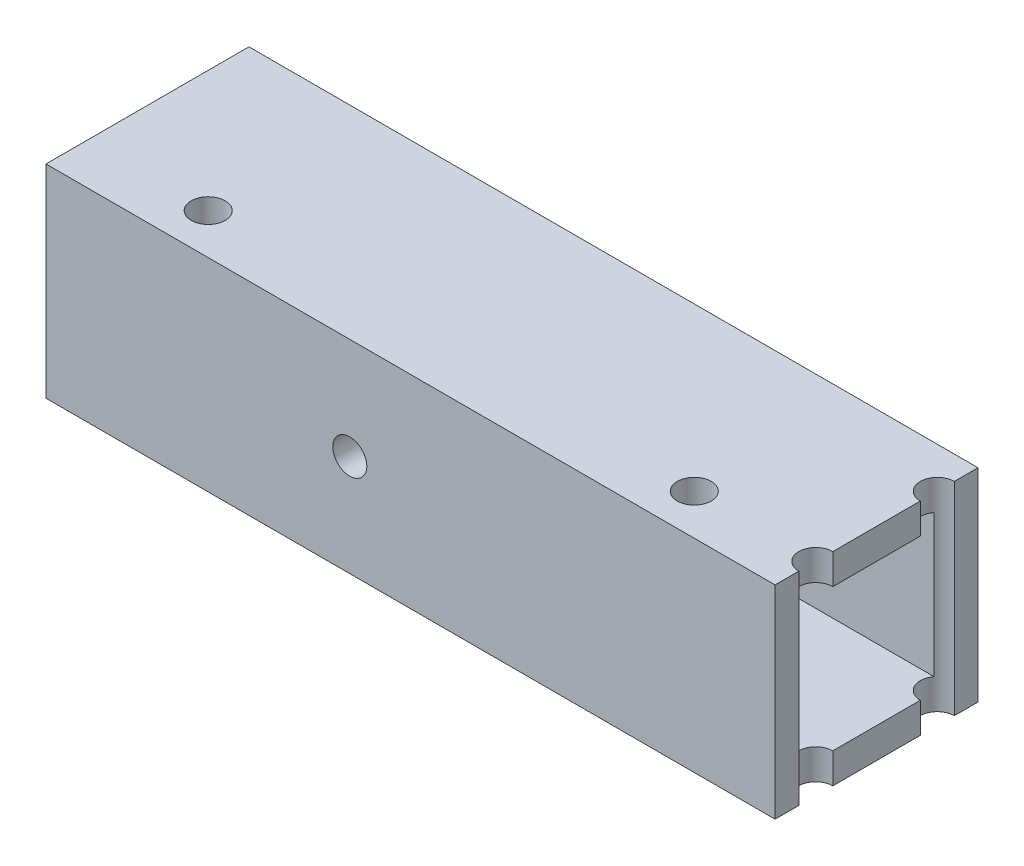
ISO-10303-21;
HEADER;
FILE_DESCRIPTION(('STEP AP214'),'2;1');
FILE_NAME('part.step','',(''),(''),'','','');
FILE_SCHEMA(('AUTOMOTIVE_DESIGN { 1 0 10303 214 1 1 1 1 }'));
ENDSEC;
DATA;
#1=APPLICATION_CONTEXT('core data for automotive mechanical design processes');
#2=APPLICATION_PROTOCOL_DEFINITION('international standard','automotive_design',2000,#1);
#3=PRODUCT_CONTEXT('',#1,'mechanical');
#4=PRODUCT('Part','Part','',(#3));
#5=PRODUCT_RELATED_PRODUCT_CATEGORY('part','',(#4));
#6=PRODUCT_DEFINITION_FORMATION('','',#4);
#7=PRODUCT_DEFINITION_CONTEXT('part definition',#1,'design');
#8=PRODUCT_DEFINITION('design','',#6,#7);
#9=PRODUCT_DEFINITION_SHAPE('','',#8);
#10=(LENGTH_UNIT() NAMED_UNIT(*) SI_UNIT(.MILLI.,.METRE.));
#11=(NAMED_UNIT(*) PLANE_ANGLE_UNIT() SI_UNIT($,.RADIAN.));
#12=(NAMED_UNIT(*) SI_UNIT($,.STERADIAN.) SOLID_ANGLE_UNIT());
#13=UNCERTAINTY_MEASURE_WITH_UNIT(LENGTH_MEASURE(1.E-05),#10,'distance_accuracy_value','');
#14=(GEOMETRIC_REPRESENTATION_CONTEXT(3) GLOBAL_UNCERTAINTY_ASSIGNED_CONTEXT((#13)) GLOBAL_UNIT_ASSIGNED_CONTEXT((#10,
#11,#12)) REPRESENTATION_CONTEXT('',''));
#15=CARTESIAN_POINT('',(0.,0.,0.));
#16=DIRECTION('',(0.,0.,1.));
#17=DIRECTION('',(1.,0.,0.));
#18=AXIS2_PLACEMENT_3D('',#15,#16,#17);
#19=CARTESIAN_POINT('',(-32.2248595461292,-133.7,131.699999999999));
#20=DIRECTION('',(0.,0.,1.));
#21=DIRECTION('',(1.,0.,0.));
#22=AXIS2_PLACEMENT_3D('',#19,#20,#21);
#23=PLANE('',#22);
#24=DIRECTION('',(1.,0.,0.));
#25=VECTOR('',#24,1.);
#26=CARTESIAN_POINT('',(-32.2248595461292,-133.7,131.699999999999));
#27=LINE('',#26,#25);
#28=CARTESIAN_POINT('',(-47.7751404538709,-133.7,131.699999999999));
#29=VERTEX_POINT('',#28);
#30=CARTESIAN_POINT('',(-32.2248595461292,-133.7,131.699999999999));
#31=VERTEX_POINT('',#30);
#32=EDGE_CURVE('E193',#29,#31,#27,.T.);
#33=ORIENTED_EDGE('',*,*,#32,.F.);
#34=DIRECTION('',(0.,1.,0.));
#35=VECTOR('',#34,1.);
#36=CARTESIAN_POINT('',(-47.7751404538709,-105.3,131.699999999999));
#37=LINE('',#36,#35);
#38=CARTESIAN_POINT('',(-47.7751404538709,-110.3,131.699999999999));
#39=VERTEX_POINT('',#38);
#40=EDGE_CURVE('E61',#29,#39,#37,.T.);
#41=ORIENTED_EDGE('',*,*,#40,.T.);
#42=DIRECTION('',(1.,0.,0.));
#43=VECTOR('',#42,1.);
#44=CARTESIAN_POINT('',(-32.2248595461292,-110.3,131.699999999999));
#45=LINE('',#44,#43);
#46=CARTESIAN_POINT('',(-32.2248595461291,-110.3,131.699999999999));
#47=VERTEX_POINT('',#46);
#48=EDGE_CURVE('E205',#39,#47,#45,.T.);
#49=ORIENTED_EDGE('',*,*,#48,.T.);
#50=DIRECTION('',(0.,1.,0.));
#51=VECTOR('',#50,1.);
#52=CARTESIAN_POINT('',(-32.2248595461292,-133.7,131.699999999999));
#53=LINE('',#52,#51);
#54=EDGE_CURVE('E197',#31,#47,#53,.T.);
#55=ORIENTED_EDGE('',*,*,#54,.F.);
#56=EDGE_LOOP('',(#33,#41,#49,#55));
#57=FACE_BOUND('',#56,.T.);
#58=ADVANCED_FACE('F43',(#57),#23,.F.);
#59=CARTESIAN_POINT('',(-100.,-122.,131.7));
#60=DIRECTION('',(0.,0.,-1.));
#61=DIRECTION('',(-1.,0.,0.));
#62=AXIS2_PLACEMENT_3D('',#59,#60,#61);
#63=CIRCLE('',#62,2.79999999999998);
#64=CARTESIAN_POINT('',(-102.8,-122.,131.7));
#65=VERTEX_POINT('',#64);
#66=EDGE_CURVE('E421',#65,#65,#63,.T.);
#67=ORIENTED_EDGE('',*,*,#66,.F.);
#68=EDGE_LOOP('',(#67));
#69=FACE_BOUND('',#68,.T.);
#70=CARTESIAN_POINT('',(-127.775140453871,-110.3,131.7));
#71=VERTEX_POINT('',#70);
#72=CARTESIAN_POINT('',(-52.2248595461291,-110.3,131.699999999999));
#73=VERTEX_POINT('',#72);
#74=EDGE_CURVE('E185',#71,#73,#45,.T.);
#75=ORIENTED_EDGE('',*,*,#74,.T.);
#76=DIRECTION('',(0.,1.,0.));
#77=VECTOR('',#76,1.);
#78=CARTESIAN_POINT('',(-52.2248595461291,-105.3,131.699999999999));
#79=LINE('',#78,#77);
#80=CARTESIAN_POINT('',(-52.2248595461291,-133.7,131.699999999999));
#81=VERTEX_POINT('',#80);
#82=EDGE_CURVE('E171',#73,#81,#79,.F.);
#83=ORIENTED_EDGE('',*,*,#82,.T.);
#84=CARTESIAN_POINT('',(-127.775140453871,-133.7,131.7));
#85=VERTEX_POINT('',#84);
#86=EDGE_CURVE('E183',#85,#81,#27,.T.);
#87=ORIENTED_EDGE('',*,*,#86,.F.);
#88=DIRECTION('',(0.,1.,0.));
#89=VECTOR('',#88,1.);
#90=CARTESIAN_POINT('',(-127.775140453871,-105.3,131.7));
#91=LINE('',#90,#89);
#92=EDGE_CURVE('E69',#85,#71,#91,.T.);
#93=ORIENTED_EDGE('',*,*,#92,.T.);
#94=EDGE_LOOP('',(#75,#83,#87,#93));
#95=FACE_BOUND('',#94,.T.);
#96=ADVANCED_FACE('F182',(#69,#95),#23,.F.);
#97=CARTESIAN_POINT('',(-30.,-110.3,110.));
#98=DIRECTION('',(0.,-1.,0.));
#99=DIRECTION('',(0.,0.,-1.));
#100=AXIS2_PLACEMENT_3D('',#97,#98,#99);
#101=PLANE('',#100);
#102=CARTESIAN_POINT('',(-50.,-110.3,130.));
#103=DIRECTION('',(0.,-1.,0.));
#104=DIRECTION('',(0.,0.,-1.));
#105=AXIS2_PLACEMENT_3D('',#102,#103,#104);
#106=CIRCLE('',#105,2.79999999999998);
#107=EDGE_CURVE('E405',#73,#39,#106,.T.);
#108=ORIENTED_EDGE('',*,*,#107,.F.);
#109=ORIENTED_EDGE('',*,*,#74,.F.);
#110=CARTESIAN_POINT('',(-130.,-110.3,130.));
#111=DIRECTION('',(0.,-1.,0.));
#112=DIRECTION('',(0.,0.,-1.));
#113=AXIS2_PLACEMENT_3D('',#110,#111,#112);
#114=CIRCLE('',#113,2.79999999999998);
#115=CARTESIAN_POINT('',(-132.224859546129,-110.3,131.7));
#116=VERTEX_POINT('',#115);
#117=EDGE_CURVE('E388',#116,#71,#114,.T.);
#118=ORIENTED_EDGE('',*,*,#117,.F.);
#119=CARTESIAN_POINT('',(-150.,-110.3,131.7));
#120=VERTEX_POINT('',#119);
#121=EDGE_CURVE('E207',#120,#116,#45,.T.);
#122=ORIENTED_EDGE('',*,*,#121,.F.);
#123=DIRECTION('',(0.,0.,-1.));
#124=VECTOR('',#123,1.);
#125=CARTESIAN_POINT('',(-150.,-110.3,132.8));
#126=LINE('',#125,#124);
#127=CARTESIAN_POINT('',(-150.,-110.3,108.3));
#128=VERTEX_POINT('',#127);
#129=EDGE_CURVE('E247',#120,#128,#126,.T.);
#130=ORIENTED_EDGE('',*,*,#129,.T.);
#131=DIRECTION('',(-1.,0.,0.));
#132=VECTOR('',#131,1.);
#133=CARTESIAN_POINT('',(-150.,-110.3,108.3));
#134=LINE('',#133,#132);
#135=CARTESIAN_POINT('',(-32.2248595461215,-110.3,108.299999999999));
#136=VERTEX_POINT('',#135);
#137=EDGE_CURVE('E319',#136,#128,#134,.T.);
#138=ORIENTED_EDGE('',*,*,#137,.F.);
#139=CARTESIAN_POINT('',(-29.9999999999975,-110.3,110.000000000002));
#140=DIRECTION('',(0.,-1.,0.));
#141=DIRECTION('',(0.,0.,1.));
#142=AXIS2_PLACEMENT_3D('',#139,#140,#141);
#143=CIRCLE('',#142,2.79999999999783);
#144=CARTESIAN_POINT('',(-30.,-110.3,112.799999999995));
#145=VERTEX_POINT('',#144);
#146=EDGE_CURVE('E313',#145,#136,#143,.T.);
#147=ORIENTED_EDGE('',*,*,#146,.F.);
#148=DIRECTION('',(0.,0.,1.));
#149=VECTOR('',#148,1.);
#150=CARTESIAN_POINT('',(-30.,-110.3,112.8));
#151=LINE('',#150,#149);
#152=CARTESIAN_POINT('',(-30.,-110.3,127.2));
#153=VERTEX_POINT('',#152);
#154=EDGE_CURVE('E252',#145,#153,#151,.T.);
#155=ORIENTED_EDGE('',*,*,#154,.T.);
#156=CARTESIAN_POINT('',(-30.,-110.3,130.));
#157=DIRECTION('',(0.,-1.,0.));
#158=DIRECTION('',(0.,0.,1.));
#159=AXIS2_PLACEMENT_3D('',#156,#157,#158);
#160=CIRCLE('',#159,2.8);
#161=EDGE_CURVE('E202',#47,#153,#160,.T.);
#162=ORIENTED_EDGE('',*,*,#161,.F.);
#163=ORIENTED_EDGE('',*,*,#48,.F.);
#164=EDGE_LOOP('',(#108,#109,#118,#122,#130,#138,#147,#155,#162,#163));
#165=FACE_BOUND('',#164,.T.);
#166=ADVANCED_FACE('F337',(#165),#101,.T.);
#167=CARTESIAN_POINT('',(-30.,-105.3,112.8));
#168=DIRECTION('',(1.,0.,0.));
#169=DIRECTION('',(0.,0.,-1.));
#170=AXIS2_PLACEMENT_3D('',#167,#168,#169);
#171=PLANE('',#170);
#172=ORIENTED_EDGE('',*,*,#154,.F.);
#173=DIRECTION('',(0.,-1.,0.));
#174=VECTOR('',#173,1.);
#175=CARTESIAN_POINT('',(-30.,-105.3,112.8));
#176=LINE('',#175,#174);
#177=CARTESIAN_POINT('',(-30.,-105.3,112.799999999995));
#178=VERTEX_POINT('',#177);
#179=EDGE_CURVE('E264',#178,#145,#176,.T.);
#180=ORIENTED_EDGE('',*,*,#179,.F.);
#181=DIRECTION('',(0.,0.,1.));
#182=VECTOR('',#181,1.);
#183=CARTESIAN_POINT('',(-30.,-105.3,112.8));
#184=LINE('',#183,#182);
#185=CARTESIAN_POINT('',(-30.,-105.3,127.2));
#186=VERTEX_POINT('',#185);
#187=EDGE_CURVE('E251',#178,#186,#184,.T.);
#188=ORIENTED_EDGE('',*,*,#187,.T.);
#189=DIRECTION('',(0.,-1.,0.));
#190=VECTOR('',#189,1.);
#191=CARTESIAN_POINT('',(-30.,-105.3,127.2));
#192=LINE('',#191,#190);
#193=EDGE_CURVE('E53',#186,#153,#192,.T.);
#194=ORIENTED_EDGE('',*,*,#193,.T.);
#195=EDGE_LOOP('',(#172,#180,#188,#194));
#196=FACE_BOUND('',#195,.T.);
#197=ADVANCED_FACE('F472',(#196),#171,.T.);
#198=CARTESIAN_POINT('',(-150.,-105.3,132.8));
#199=DIRECTION('',(-1.,0.,0.));
#200=DIRECTION('',(0.,0.,1.));
#201=AXIS2_PLACEMENT_3D('',#198,#199,#200);
#202=PLANE('',#201);
#203=DIRECTION('',(0.,1.,0.));
#204=VECTOR('',#203,1.);
#205=CARTESIAN_POINT('',(-150.,-133.7,131.7));
#206=LINE('',#205,#204);
#207=CARTESIAN_POINT('',(-150.,-133.7,131.7));
#208=VERTEX_POINT('',#207);
#209=EDGE_CURVE('E214',#208,#120,#206,.T.);
#210=ORIENTED_EDGE('',*,*,#209,.F.);
#211=DIRECTION('',(0.,0.,-1.));
#212=VECTOR('',#211,1.);
#213=CARTESIAN_POINT('',(-150.,-133.7,103.3));
#214=LINE('',#213,#212);
#215=CARTESIAN_POINT('',(-150.,-133.7,108.3));
#216=VERTEX_POINT('',#215);
#217=EDGE_CURVE('E304',#208,#216,#214,.T.);
#218=ORIENTED_EDGE('',*,*,#217,.T.);
#219=DIRECTION('',(0.,1.,0.));
#220=VECTOR('',#219,1.);
#221=CARTESIAN_POINT('',(-150.,-133.7,108.3));
#222=LINE('',#221,#220);
#223=EDGE_CURVE('E323',#216,#128,#222,.T.);
#224=ORIENTED_EDGE('',*,*,#223,.T.);
#225=ORIENTED_EDGE('',*,*,#129,.F.);
#226=EDGE_LOOP('',(#210,#218,#224,#225));
#227=FACE_BOUND('',#226,.T.);
#228=DIRECTION('',(0.,0.,-1.));
#229=VECTOR('',#228,1.);
#230=CARTESIAN_POINT('',(-150.,-138.7,103.3));
#231=LINE('',#230,#229);
#232=CARTESIAN_POINT('',(-150.,-138.7,136.7));
#233=VERTEX_POINT('',#232);
#234=CARTESIAN_POINT('',(-150.,-138.7,103.3));
#235=VERTEX_POINT('',#234);
#236=EDGE_CURVE('E296',#233,#235,#231,.T.);
#237=ORIENTED_EDGE('',*,*,#236,.F.);
#238=DIRECTION('',(0.,-1.,0.));
#239=VECTOR('',#238,1.);
#240=CARTESIAN_POINT('',(-150.,-110.3,136.7));
#241=LINE('',#240,#239);
#242=CARTESIAN_POINT('',(-150.,-105.3,136.7));
#243=VERTEX_POINT('',#242);
#244=EDGE_CURVE('E226',#243,#233,#241,.T.);
#245=ORIENTED_EDGE('',*,*,#244,.F.);
#246=DIRECTION('',(0.,0.,-1.));
#247=VECTOR('',#246,1.);
#248=CARTESIAN_POINT('',(-150.,-105.3,132.8));
#249=LINE('',#248,#247);
#250=CARTESIAN_POINT('',(-150.,-105.3,103.3));
#251=VERTEX_POINT('',#250);
#252=EDGE_CURVE('E248',#243,#251,#249,.T.);
#253=ORIENTED_EDGE('',*,*,#252,.T.);
#254=DIRECTION('',(0.,1.,0.));
#255=VECTOR('',#254,1.);
#256=CARTESIAN_POINT('',(-150.,-105.3,103.3));
#257=LINE('',#256,#255);
#258=EDGE_CURVE('E233',#235,#251,#257,.T.);
#259=ORIENTED_EDGE('',*,*,#258,.F.);
#260=EDGE_LOOP('',(#237,#245,#253,#259));
#261=FACE_BOUND('',#260,.T.);
#262=ADVANCED_FACE('F45',(#227,#261),#202,.T.);
#263=CARTESIAN_POINT('',(-30.,-105.3,110.));
#264=DIRECTION('',(0.,-1.,0.));
#265=DIRECTION('',(0.,0.,-1.));
#266=AXIS2_PLACEMENT_3D('',#263,#264,#265);
#267=PLANE('',#266);
#268=CARTESIAN_POINT('',(-50.,-105.3,130.));
#269=DIRECTION('',(0.,1.,0.));
#270=DIRECTION('',(0.,0.,1.));
#271=AXIS2_PLACEMENT_3D('',#268,#269,#270);
#272=CIRCLE('',#271,2.79999999999998);
#273=CARTESIAN_POINT('',(-50.,-105.3,132.8));
#274=VERTEX_POINT('',#273);
#275=EDGE_CURVE('E413',#274,#274,#272,.T.);
#276=ORIENTED_EDGE('',*,*,#275,.F.);
#277=EDGE_LOOP('',(#276));
#278=FACE_BOUND('',#277,.T.);
#279=CARTESIAN_POINT('',(-130.,-105.3,130.));
#280=DIRECTION('',(0.,1.,0.));
#281=DIRECTION('',(0.,0.,1.));
#282=AXIS2_PLACEMENT_3D('',#279,#280,#281);
#283=CIRCLE('',#282,2.8);
#284=CARTESIAN_POINT('',(-130.,-105.3,132.8));
#285=VERTEX_POINT('',#284);
#286=EDGE_CURVE('E401',#285,#285,#283,.T.);
#287=ORIENTED_EDGE('',*,*,#286,.F.);
#288=EDGE_LOOP('',(#287));
#289=FACE_BOUND('',#288,.T.);
#290=DIRECTION('',(0.,0.,-1.));
#291=VECTOR('',#290,1.);
#292=CARTESIAN_POINT('',(-30.,-105.3,136.7));
#293=LINE('',#292,#291);
#294=CARTESIAN_POINT('',(-30.,-105.3,136.7));
#295=VERTEX_POINT('',#294);
#296=CARTESIAN_POINT('',(-30.,-105.3,132.8));
#297=VERTEX_POINT('',#296);
#298=EDGE_CURVE('E229',#295,#297,#293,.T.);
#299=ORIENTED_EDGE('',*,*,#298,.T.);
#300=CARTESIAN_POINT('',(-30.,-105.3,130.));
#301=DIRECTION('',(0.,-1.,0.));
#302=DIRECTION('',(0.,0.,-1.));
#303=AXIS2_PLACEMENT_3D('',#300,#301,#302);
#304=CIRCLE('',#303,2.79999999999999);
#305=EDGE_CURVE('E381',#297,#186,#304,.T.);
#306=ORIENTED_EDGE('',*,*,#305,.T.);
#307=ORIENTED_EDGE('',*,*,#187,.F.);
#308=CARTESIAN_POINT('',(-30.,-105.3,110.));
#309=DIRECTION('',(0.,-1.,0.));
#310=DIRECTION('',(0.,0.,-1.));
#311=AXIS2_PLACEMENT_3D('',#308,#309,#310);
#312=CIRCLE('',#311,2.79999999999499);
#313=CARTESIAN_POINT('',(-30.,-105.3,107.200000000005));
#314=VERTEX_POINT('',#313);
#315=EDGE_CURVE('E305',#178,#314,#312,.T.);
#316=ORIENTED_EDGE('',*,*,#315,.T.);
#317=DIRECTION('',(0.,0.,1.));
#318=VECTOR('',#317,1.);
#319=CARTESIAN_POINT('',(-30.,-105.3,103.3));
#320=LINE('',#319,#318);
#321=CARTESIAN_POINT('',(-30.,-105.3,103.3));
#322=VERTEX_POINT('',#321);
#323=EDGE_CURVE('E243',#322,#314,#320,.T.);
#324=ORIENTED_EDGE('',*,*,#323,.F.);
#325=DIRECTION('',(1.,0.,0.));
#326=VECTOR('',#325,1.);
#327=CARTESIAN_POINT('',(-30.,-105.3,103.3));
#328=LINE('',#327,#326);
#329=EDGE_CURVE('E237',#251,#322,#328,.T.);
#330=ORIENTED_EDGE('',*,*,#329,.F.);
#331=ORIENTED_EDGE('',*,*,#252,.F.);
#332=DIRECTION('',(-1.,0.,0.));
#333=VECTOR('',#332,1.);
#334=CARTESIAN_POINT('',(-150.,-105.3,136.7));
#335=LINE('',#334,#333);
#336=EDGE_CURVE('E222',#295,#243,#335,.T.);
#337=ORIENTED_EDGE('',*,*,#336,.F.);
#338=EDGE_LOOP('',(#299,#306,#307,#316,#324,#330,#331,#337));
#339=FACE_BOUND('',#338,.T.);
#340=ADVANCED_FACE('F376',(#278,#289,#339),#267,.F.);
#341=CARTESIAN_POINT('',(-30.,-110.3,103.3));
#342=DIRECTION('',(-1.,0.,0.));
#343=DIRECTION('',(0.,0.,1.));
#344=AXIS2_PLACEMENT_3D('',#341,#342,#343);
#345=PLANE('',#344);
#346=DIRECTION('',(0.,-1.,0.));
#347=VECTOR('',#346,1.);
#348=CARTESIAN_POINT('',(-30.,-105.3,107.2));
#349=LINE('',#348,#347);
#350=CARTESIAN_POINT('',(-30.,-138.7,107.200000000005));
#351=VERTEX_POINT('',#350);
#352=EDGE_CURVE('E47',#314,#351,#349,.T.);
#353=ORIENTED_EDGE('',*,*,#352,.T.);
#354=DIRECTION('',(0.,0.,1.));
#355=VECTOR('',#354,1.);
#356=CARTESIAN_POINT('',(-30.,-138.7,107.20000000001));
#357=LINE('',#356,#355);
#358=CARTESIAN_POINT('',(-30.,-138.7,103.3));
#359=VERTEX_POINT('',#358);
#360=EDGE_CURVE('E276',#359,#351,#357,.T.);
#361=ORIENTED_EDGE('',*,*,#360,.F.);
#362=DIRECTION('',(0.,-1.,0.));
#363=VECTOR('',#362,1.);
#364=CARTESIAN_POINT('',(-30.,-110.3,103.3));
#365=LINE('',#364,#363);
#366=EDGE_CURVE('E240',#322,#359,#365,.T.);
#367=ORIENTED_EDGE('',*,*,#366,.F.);
#368=ORIENTED_EDGE('',*,*,#323,.T.);
#369=EDGE_LOOP('',(#353,#361,#367,#368));
#370=FACE_BOUND('',#369,.T.);
#371=ADVANCED_FACE('F274',(#370),#345,.F.);
#372=CARTESIAN_POINT('',(0.,0.,103.3));
#373=DIRECTION('',(0.,0.,1.));
#374=DIRECTION('',(1.,0.,0.));
#375=AXIS2_PLACEMENT_3D('',#372,#373,#374);
#376=PLANE('',#375);
#377=CARTESIAN_POINT('',(-100.,-122.,103.3));
#378=DIRECTION('',(0.,0.,-1.));
#379=DIRECTION('',(-1.,0.,0.));
#380=AXIS2_PLACEMENT_3D('',#377,#378,#379);
#381=CIRCLE('',#380,2.79999999999998);
#382=CARTESIAN_POINT('',(-102.8,-122.,103.3));
#383=VERTEX_POINT('',#382);
#384=EDGE_CURVE('E429',#383,#383,#381,.T.);
#385=ORIENTED_EDGE('',*,*,#384,.F.);
#386=EDGE_LOOP('',(#385));
#387=FACE_BOUND('',#386,.T.);
#388=ORIENTED_EDGE('',*,*,#366,.T.);
#389=DIRECTION('',(1.,0.,0.));
#390=VECTOR('',#389,1.);
#391=CARTESIAN_POINT('',(-30.,-138.7,103.3));
#392=LINE('',#391,#390);
#393=EDGE_CURVE('E288',#235,#359,#392,.T.);
#394=ORIENTED_EDGE('',*,*,#393,.F.);
#395=ORIENTED_EDGE('',*,*,#258,.T.);
#396=ORIENTED_EDGE('',*,*,#329,.T.);
#397=EDGE_LOOP('',(#388,#394,#395,#396));
#398=FACE_BOUND('',#397,.T.);
#399=ADVANCED_FACE('F373',(#387,#398),#376,.F.);
#400=CARTESIAN_POINT('',(-30.,-105.3,136.7));
#401=DIRECTION('',(-1.,0.,0.));
#402=DIRECTION('',(0.,0.,1.));
#403=AXIS2_PLACEMENT_3D('',#400,#401,#402);
#404=PLANE('',#403);
#405=DIRECTION('',(0.,-1.,0.));
#406=VECTOR('',#405,1.);
#407=CARTESIAN_POINT('',(-30.,-105.3,132.8));
#408=LINE('',#407,#406);
#409=CARTESIAN_POINT('',(-30.,-138.7,132.8));
#410=VERTEX_POINT('',#409);
#411=EDGE_CURVE('E11',#297,#410,#408,.T.);
#412=ORIENTED_EDGE('',*,*,#411,.F.);
#413=ORIENTED_EDGE('',*,*,#298,.F.);
#414=DIRECTION('',(0.,1.,0.));
#415=VECTOR('',#414,1.);
#416=CARTESIAN_POINT('',(-30.,-105.3,136.7));
#417=LINE('',#416,#415);
#418=CARTESIAN_POINT('',(-30.,-138.7,136.7));
#419=VERTEX_POINT('',#418);
#420=EDGE_CURVE('E218',#419,#295,#417,.T.);
#421=ORIENTED_EDGE('',*,*,#420,.F.);
#422=DIRECTION('',(0.,0.,1.));
#423=VECTOR('',#422,1.);
#424=CARTESIAN_POINT('',(-30.,-138.7,136.7));
#425=LINE('',#424,#423);
#426=EDGE_CURVE('E357',#410,#419,#425,.T.);
#427=ORIENTED_EDGE('',*,*,#426,.F.);
#428=EDGE_LOOP('',(#412,#413,#421,#427));
#429=FACE_BOUND('',#428,.T.);
#430=ADVANCED_FACE('F438',(#429),#404,.F.);
#431=CARTESIAN_POINT('',(0.,0.,136.7));
#432=DIRECTION('',(0.,0.,-1.));
#433=DIRECTION('',(-1.,0.,0.));
#434=AXIS2_PLACEMENT_3D('',#431,#432,#433);
#435=PLANE('',#434);
#436=CARTESIAN_POINT('',(-100.,-122.,136.7));
#437=DIRECTION('',(0.,0.,-1.));
#438=DIRECTION('',(-1.,0.,0.));
#439=AXIS2_PLACEMENT_3D('',#436,#437,#438);
#440=CIRCLE('',#439,2.79999999999998);
#441=CARTESIAN_POINT('',(-102.8,-122.,136.7));
#442=VERTEX_POINT('',#441);
#443=EDGE_CURVE('E417',#442,#442,#440,.T.);
#444=ORIENTED_EDGE('',*,*,#443,.T.);
#445=EDGE_LOOP('',(#444));
#446=FACE_BOUND('',#445,.T.);
#447=ORIENTED_EDGE('',*,*,#420,.T.);
#448=ORIENTED_EDGE('',*,*,#336,.T.);
#449=ORIENTED_EDGE('',*,*,#244,.T.);
#450=DIRECTION('',(-1.,0.,0.));
#451=VECTOR('',#450,1.);
#452=CARTESIAN_POINT('',(-150.,-138.7,136.7));
#453=LINE('',#452,#451);
#454=EDGE_CURVE('E361',#419,#233,#453,.T.);
#455=ORIENTED_EDGE('',*,*,#454,.F.);
#456=EDGE_LOOP('',(#447,#448,#449,#455));
#457=FACE_BOUND('',#456,.T.);
#458=ADVANCED_FACE('F444',(#446,#457),#435,.F.);
#459=ORIENTED_EDGE('',*,*,#121,.T.);
#460=DIRECTION('',(0.,1.,0.));
#461=VECTOR('',#460,1.);
#462=CARTESIAN_POINT('',(-132.224859546129,-105.3,131.7));
#463=LINE('',#462,#461);
#464=CARTESIAN_POINT('',(-132.224859546129,-133.7,131.7));
#465=VERTEX_POINT('',#464);
#466=EDGE_CURVE('E348',#116,#465,#463,.F.);
#467=ORIENTED_EDGE('',*,*,#466,.T.);
#468=EDGE_CURVE('E192',#208,#465,#27,.T.);
#469=ORIENTED_EDGE('',*,*,#468,.F.);
#470=ORIENTED_EDGE('',*,*,#209,.T.);
#471=EDGE_LOOP('',(#459,#467,#469,#470));
#472=FACE_BOUND('',#471,.T.);
#473=ADVANCED_FACE('F346',(#472),#23,.F.);
#474=CARTESIAN_POINT('',(-150.,-133.7,108.3));
#475=DIRECTION('',(0.,0.,-1.));
#476=DIRECTION('',(-1.,0.,0.));
#477=AXIS2_PLACEMENT_3D('',#474,#475,#476);
#478=PLANE('',#477);
#479=CARTESIAN_POINT('',(-100.,-122.,108.3));
#480=DIRECTION('',(0.,0.,-1.));
#481=DIRECTION('',(-1.,0.,0.));
#482=AXIS2_PLACEMENT_3D('',#479,#480,#481);
#483=CIRCLE('',#482,2.79999999999998);
#484=CARTESIAN_POINT('',(-102.8,-122.,108.3));
#485=VERTEX_POINT('',#484);
#486=EDGE_CURVE('E425',#485,#485,#483,.T.);
#487=ORIENTED_EDGE('',*,*,#486,.T.);
#488=EDGE_LOOP('',(#487));
#489=FACE_BOUND('',#488,.T.);
#490=ORIENTED_EDGE('',*,*,#137,.T.);
#491=ORIENTED_EDGE('',*,*,#223,.F.);
#492=DIRECTION('',(-1.,0.,0.));
#493=VECTOR('',#492,1.);
#494=CARTESIAN_POINT('',(-150.,-133.7,108.3));
#495=LINE('',#494,#493);
#496=CARTESIAN_POINT('',(-32.2248595461215,-133.7,108.299999999999));
#497=VERTEX_POINT('',#496);
#498=EDGE_CURVE('E318',#497,#216,#495,.T.);
#499=ORIENTED_EDGE('',*,*,#498,.F.);
#500=DIRECTION('',(0.,1.,0.));
#501=VECTOR('',#500,1.);
#502=CARTESIAN_POINT('',(-32.2248595461215,-133.7,108.299999999999));
#503=LINE('',#502,#501);
#504=EDGE_CURVE('E206',#497,#136,#503,.T.);
#505=ORIENTED_EDGE('',*,*,#504,.T.);
#506=EDGE_LOOP('',(#490,#491,#499,#505));
#507=FACE_BOUND('',#506,.T.);
#508=ADVANCED_FACE('F335',(#489,#507),#478,.F.);
#509=CARTESIAN_POINT('',(-30.,-138.7,127.2));
#510=DIRECTION('',(-1.,0.,0.));
#511=DIRECTION('',(0.,0.,1.));
#512=AXIS2_PLACEMENT_3D('',#509,#510,#511);
#513=PLANE('',#512);
#514=DIRECTION('',(0.,0.,1.));
#515=VECTOR('',#514,1.);
#516=CARTESIAN_POINT('',(-30.,-133.7,127.2));
#517=LINE('',#516,#515);
#518=CARTESIAN_POINT('',(-30.,-133.7,112.799999999995));
#519=VERTEX_POINT('',#518);
#520=CARTESIAN_POINT('',(-30.,-133.7,127.2));
#521=VERTEX_POINT('',#520);
#522=EDGE_CURVE('E300',#519,#521,#517,.T.);
#523=ORIENTED_EDGE('',*,*,#522,.T.);
#524=DIRECTION('',(0.,1.,0.));
#525=VECTOR('',#524,1.);
#526=CARTESIAN_POINT('',(-30.,-138.7,127.2));
#527=LINE('',#526,#525);
#528=CARTESIAN_POINT('',(-30.,-138.7,127.2));
#529=VERTEX_POINT('',#528);
#530=EDGE_CURVE('E290',#529,#521,#527,.T.);
#531=ORIENTED_EDGE('',*,*,#530,.F.);
#532=DIRECTION('',(0.,0.,1.));
#533=VECTOR('',#532,1.);
#534=CARTESIAN_POINT('',(-30.,-138.7,127.2));
#535=LINE('',#534,#533);
#536=CARTESIAN_POINT('',(-30.,-138.7,112.799999999995));
#537=VERTEX_POINT('',#536);
#538=EDGE_CURVE('E308',#537,#529,#535,.T.);
#539=ORIENTED_EDGE('',*,*,#538,.F.);
#540=DIRECTION('',(0.,1.,0.));
#541=VECTOR('',#540,1.);
#542=CARTESIAN_POINT('',(-30.,-138.7,112.79999999999));
#543=LINE('',#542,#541);
#544=EDGE_CURVE('E294',#537,#519,#543,.T.);
#545=ORIENTED_EDGE('',*,*,#544,.T.);
#546=EDGE_LOOP('',(#523,#531,#539,#545));
#547=FACE_BOUND('',#546,.T.);
#548=ADVANCED_FACE('F353',(#547),#513,.F.);
#549=CARTESIAN_POINT('',(-30.,-138.7,110.));
#550=DIRECTION('',(0.,1.,0.));
#551=DIRECTION('',(0.,0.,1.));
#552=AXIS2_PLACEMENT_3D('',#549,#550,#551);
#553=PLANE('',#552);
#554=CARTESIAN_POINT('',(-50.,-138.7,130.));
#555=DIRECTION('',(0.,1.,0.));
#556=DIRECTION('',(0.,0.,1.));
#557=AXIS2_PLACEMENT_3D('',#554,#555,#556);
#558=CIRCLE('',#557,2.79999999999998);
#559=CARTESIAN_POINT('',(-50.,-138.7,132.8));
#560=VERTEX_POINT('',#559);
#561=EDGE_CURVE('E177',#560,#560,#558,.T.);
#562=ORIENTED_EDGE('',*,*,#561,.T.);
#563=EDGE_LOOP('',(#562));
#564=FACE_BOUND('',#563,.T.);
#565=CARTESIAN_POINT('',(-130.,-138.7,130.));
#566=DIRECTION('',(0.,1.,0.));
#567=DIRECTION('',(0.,0.,1.));
#568=AXIS2_PLACEMENT_3D('',#565,#566,#567);
#569=CIRCLE('',#568,2.79999999999997);
#570=CARTESIAN_POINT('',(-130.,-138.7,132.8));
#571=VERTEX_POINT('',#570);
#572=EDGE_CURVE('E397',#571,#571,#569,.T.);
#573=ORIENTED_EDGE('',*,*,#572,.T.);
#574=EDGE_LOOP('',(#573));
#575=FACE_BOUND('',#574,.T.);
#576=ORIENTED_EDGE('',*,*,#538,.T.);
#577=CARTESIAN_POINT('',(-30.,-138.7,130.));
#578=DIRECTION('',(0.,-1.,0.));
#579=DIRECTION('',(0.,0.,-1.));
#580=AXIS2_PLACEMENT_3D('',#577,#578,#579);
#581=CIRCLE('',#580,2.8);
#582=EDGE_CURVE('E383',#410,#529,#581,.T.);
#583=ORIENTED_EDGE('',*,*,#582,.F.);
#584=ORIENTED_EDGE('',*,*,#426,.T.);
#585=ORIENTED_EDGE('',*,*,#454,.T.);
#586=ORIENTED_EDGE('',*,*,#236,.T.);
#587=ORIENTED_EDGE('',*,*,#393,.T.);
#588=ORIENTED_EDGE('',*,*,#360,.T.);
#589=CARTESIAN_POINT('',(-30.,-138.7,110.));
#590=DIRECTION('',(0.,-1.,0.));
#591=DIRECTION('',(0.,0.,-1.));
#592=AXIS2_PLACEMENT_3D('',#589,#590,#591);
#593=CIRCLE('',#592,2.79999999999499);
#594=EDGE_CURVE('E284',#537,#351,#593,.T.);
#595=ORIENTED_EDGE('',*,*,#594,.F.);
#596=EDGE_LOOP('',(#576,#583,#584,#585,#586,#587,#588,#595));
#597=FACE_BOUND('',#596,.T.);
#598=ADVANCED_FACE('F283',(#564,#575,#597),#553,.F.);
#599=CARTESIAN_POINT('',(-30.,-133.7,110.));
#600=DIRECTION('',(0.,1.,0.));
#601=DIRECTION('',(0.,0.,1.));
#602=AXIS2_PLACEMENT_3D('',#599,#600,#601);
#603=PLANE('',#602);
#604=CARTESIAN_POINT('',(-50.,-133.7,130.));
#605=DIRECTION('',(0.,1.,0.));
#606=DIRECTION('',(0.,0.,1.));
#607=AXIS2_PLACEMENT_3D('',#604,#605,#606);
#608=CIRCLE('',#607,2.79999999999998);
#609=EDGE_CURVE('E167',#29,#81,#608,.T.);
#610=ORIENTED_EDGE('',*,*,#609,.F.);
#611=ORIENTED_EDGE('',*,*,#32,.T.);
#612=CARTESIAN_POINT('',(-30.,-133.7,130.));
#613=DIRECTION('',(0.,-1.,0.));
#614=DIRECTION('',(0.,0.,1.));
#615=AXIS2_PLACEMENT_3D('',#612,#613,#614);
#616=CIRCLE('',#615,2.8);
#617=EDGE_CURVE('E198',#31,#521,#616,.T.);
#618=ORIENTED_EDGE('',*,*,#617,.T.);
#619=ORIENTED_EDGE('',*,*,#522,.F.);
#620=CARTESIAN_POINT('',(-29.9999999999975,-133.7,110.000000000002));
#621=DIRECTION('',(0.,-1.,0.));
#622=DIRECTION('',(0.,0.,1.));
#623=AXIS2_PLACEMENT_3D('',#620,#621,#622);
#624=CIRCLE('',#623,2.79999999999783);
#625=EDGE_CURVE('E314',#519,#497,#624,.T.);
#626=ORIENTED_EDGE('',*,*,#625,.T.);
#627=ORIENTED_EDGE('',*,*,#498,.T.);
#628=ORIENTED_EDGE('',*,*,#217,.F.);
#629=ORIENTED_EDGE('',*,*,#468,.T.);
#630=CARTESIAN_POINT('',(-130.,-133.7,130.));
#631=DIRECTION('',(0.,1.,0.));
#632=DIRECTION('',(0.,0.,1.));
#633=AXIS2_PLACEMENT_3D('',#630,#631,#632);
#634=CIRCLE('',#633,2.79999999999998);
#635=EDGE_CURVE('E190',#85,#465,#634,.T.);
#636=ORIENTED_EDGE('',*,*,#635,.F.);
#637=ORIENTED_EDGE('',*,*,#86,.T.);
#638=EDGE_LOOP('',(#610,#611,#618,#619,#626,#627,#628,#629,#636,#637));
#639=FACE_BOUND('',#638,.T.);
#640=ADVANCED_FACE('F188',(#639),#603,.T.);
#641=CARTESIAN_POINT('',(-30.,-105.3,110.));
#642=DIRECTION('',(0.,-1.,0.));
#643=DIRECTION('',(0.,0.,-1.));
#644=AXIS2_PLACEMENT_3D('',#641,#642,#643);
#645=CYLINDRICAL_SURFACE('',#644,2.79999999999499);
#646=ORIENTED_EDGE('',*,*,#315,.F.);
#647=ORIENTED_EDGE('',*,*,#179,.T.);
#648=ORIENTED_EDGE('',*,*,#146,.T.);
#649=ORIENTED_EDGE('',*,*,#504,.F.);
#650=ORIENTED_EDGE('',*,*,#625,.F.);
#651=ORIENTED_EDGE('',*,*,#544,.F.);
#652=ORIENTED_EDGE('',*,*,#594,.T.);
#653=ORIENTED_EDGE('',*,*,#352,.F.);
#654=EDGE_LOOP('',(#646,#647,#648,#649,#650,#651,#652,#653));
#655=FACE_BOUND('',#654,.T.);
#656=ADVANCED_FACE('F351',(#655),#645,.F.);
#657=CARTESIAN_POINT('',(-30.,-105.3,130.));
#658=DIRECTION('',(0.,-1.,0.));
#659=DIRECTION('',(0.,0.,-1.));
#660=AXIS2_PLACEMENT_3D('',#657,#658,#659);
#661=CYLINDRICAL_SURFACE('',#660,2.79999999999999);
#662=ORIENTED_EDGE('',*,*,#582,.T.);
#663=ORIENTED_EDGE('',*,*,#530,.T.);
#664=ORIENTED_EDGE('',*,*,#617,.F.);
#665=ORIENTED_EDGE('',*,*,#54,.T.);
#666=ORIENTED_EDGE('',*,*,#161,.T.);
#667=ORIENTED_EDGE('',*,*,#193,.F.);
#668=ORIENTED_EDGE('',*,*,#305,.F.);
#669=ORIENTED_EDGE('',*,*,#411,.T.);
#670=EDGE_LOOP('',(#662,#663,#664,#665,#666,#667,#668,#669));
#671=FACE_BOUND('',#670,.T.);
#672=ADVANCED_FACE('F487',(#671),#661,.F.);
#673=CARTESIAN_POINT('',(-130.,-105.3,130.));
#674=DIRECTION('',(0.,1.,0.));
#675=DIRECTION('',(0.,0.,1.));
#676=AXIS2_PLACEMENT_3D('',#673,#674,#675);
#677=CYLINDRICAL_SURFACE('',#676,2.79999999999998);
#678=ORIENTED_EDGE('',*,*,#117,.T.);
#679=ORIENTED_EDGE('',*,*,#92,.F.);
#680=ORIENTED_EDGE('',*,*,#635,.T.);
#681=ORIENTED_EDGE('',*,*,#466,.F.);
#682=EDGE_LOOP('',(#678,#679,#680,#681));
#683=FACE_BOUND('',#682,.T.);
#684=ORIENTED_EDGE('',*,*,#572,.F.);
#685=EDGE_LOOP('',(#684));
#686=FACE_BOUND('',#685,.T.);
#687=ORIENTED_EDGE('',*,*,#286,.T.);
#688=EDGE_LOOP('',(#687));
#689=FACE_BOUND('',#688,.T.);
#690=ADVANCED_FACE('F494',(#683,#686,#689),#677,.F.);
#691=CARTESIAN_POINT('',(-50.,-105.3,130.));
#692=DIRECTION('',(0.,1.,0.));
#693=DIRECTION('',(0.,0.,1.));
#694=AXIS2_PLACEMENT_3D('',#691,#692,#693);
#695=CYLINDRICAL_SURFACE('',#694,2.79999999999998);
#696=ORIENTED_EDGE('',*,*,#107,.T.);
#697=ORIENTED_EDGE('',*,*,#40,.F.);
#698=ORIENTED_EDGE('',*,*,#609,.T.);
#699=ORIENTED_EDGE('',*,*,#82,.F.);
#700=EDGE_LOOP('',(#696,#697,#698,#699));
#701=FACE_BOUND('',#700,.T.);
#702=ORIENTED_EDGE('',*,*,#561,.F.);
#703=EDGE_LOOP('',(#702));
#704=FACE_BOUND('',#703,.T.);
#705=ORIENTED_EDGE('',*,*,#275,.T.);
#706=EDGE_LOOP('',(#705));
#707=FACE_BOUND('',#706,.T.);
#708=ADVANCED_FACE('F169',(#701,#704,#707),#695,.F.);
#709=CARTESIAN_POINT('',(-100.,-122.,131.7));
#710=DIRECTION('',(0.,0.,-1.));
#711=DIRECTION('',(-1.,0.,0.));
#712=AXIS2_PLACEMENT_3D('',#709,#710,#711);
#713=CYLINDRICAL_SURFACE('',#712,2.79999999999998);
#714=ORIENTED_EDGE('',*,*,#443,.F.);
#715=EDGE_LOOP('',(#714));
#716=FACE_BOUND('',#715,.T.);
#717=ORIENTED_EDGE('',*,*,#66,.T.);
#718=EDGE_LOOP('',(#717));
#719=FACE_BOUND('',#718,.T.);
#720=ADVANCED_FACE('F608',(#716,#719),#713,.F.);
#721=CARTESIAN_POINT('',(-100.,-122.,103.3));
#722=DIRECTION('',(0.,0.,-1.));
#723=DIRECTION('',(-1.,0.,0.));
#724=AXIS2_PLACEMENT_3D('',#721,#722,#723);
#725=CYLINDRICAL_SURFACE('',#724,2.79999999999998);
#726=ORIENTED_EDGE('',*,*,#384,.T.);
#727=EDGE_LOOP('',(#726));
#728=FACE_BOUND('',#727,.T.);
#729=ORIENTED_EDGE('',*,*,#486,.F.);
#730=EDGE_LOOP('',(#729));
#731=FACE_BOUND('',#730,.T.);
#732=ADVANCED_FACE('F434',(#728,#731),#725,.F.);
#733=CLOSED_SHELL('',(#58,#96,#166,#197,#262,#340,#371,#399,#430,#458,#473,#508,#548,#598,#640,
#656,#672,#690,#708,#720,#732));
#734=MANIFOLD_SOLID_BREP('B2',#733);
#735=ADVANCED_BREP_SHAPE_REPRESENTATION('',(#18,#734),#14);
#736=SHAPE_DEFINITION_REPRESENTATION(#9,#735);
ENDSEC;
END-ISO-10303-21;
